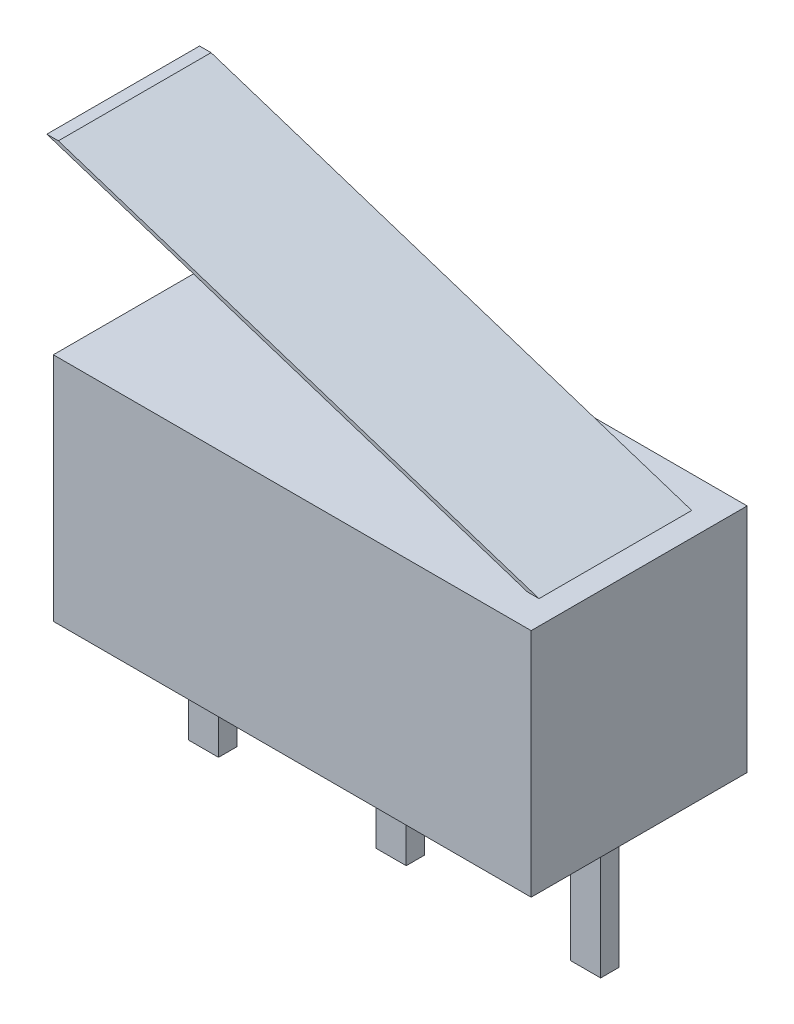
ISO-10303-21;
HEADER;
FILE_DESCRIPTION(('STEP AP214'),'2;1');
FILE_NAME('part.step','',(''),(''),'','','');
FILE_SCHEMA(('AUTOMOTIVE_DESIGN { 1 0 10303 214 1 1 1 1 }'));
ENDSEC;
DATA;
#1=APPLICATION_CONTEXT('core data for automotive mechanical design processes');
#2=APPLICATION_PROTOCOL_DEFINITION('international standard','automotive_design',2000,#1);
#3=PRODUCT_CONTEXT('',#1,'mechanical');
#4=PRODUCT('Part','Part','',(#3));
#5=PRODUCT_RELATED_PRODUCT_CATEGORY('part','',(#4));
#6=PRODUCT_DEFINITION_FORMATION('','',#4);
#7=PRODUCT_DEFINITION_CONTEXT('part definition',#1,'design');
#8=PRODUCT_DEFINITION('design','',#6,#7);
#9=PRODUCT_DEFINITION_SHAPE('','',#8);
#10=(LENGTH_UNIT() NAMED_UNIT(*) SI_UNIT(.MILLI.,.METRE.));
#11=(NAMED_UNIT(*) PLANE_ANGLE_UNIT() SI_UNIT($,.RADIAN.));
#12=(NAMED_UNIT(*) SI_UNIT($,.STERADIAN.) SOLID_ANGLE_UNIT());
#13=UNCERTAINTY_MEASURE_WITH_UNIT(LENGTH_MEASURE(1.E-05),#10,'distance_accuracy_value','');
#14=(GEOMETRIC_REPRESENTATION_CONTEXT(3) GLOBAL_UNCERTAINTY_ASSIGNED_CONTEXT((#13)) GLOBAL_UNIT_ASSIGNED_CONTEXT((#10,
#11,#12)) REPRESENTATION_CONTEXT('',''));
#15=CARTESIAN_POINT('',(0.,0.,0.));
#16=DIRECTION('',(0.,0.,1.));
#17=DIRECTION('',(1.,0.,0.));
#18=AXIS2_PLACEMENT_3D('',#15,#16,#17);
#19=CARTESIAN_POINT('',(0.,0.,0.));
#20=DIRECTION('',(0.,-1.,0.));
#21=DIRECTION('',(0.,0.,-1.));
#22=AXIS2_PLACEMENT_3D('',#19,#20,#21);
#23=PLANE('',#22);
#24=DIRECTION('',(0.,0.,-1.));
#25=VECTOR('',#24,1.);
#26=CARTESIAN_POINT('',(6.415,0.,2.9));
#27=LINE('',#26,#25);
#28=CARTESIAN_POINT('',(6.415,0.,2.9));
#29=VERTEX_POINT('',#28);
#30=CARTESIAN_POINT('',(6.415,0.,-2.9));
#31=VERTEX_POINT('',#30);
#32=EDGE_CURVE('E288',#29,#31,#27,.T.);
#33=ORIENTED_EDGE('',*,*,#32,.F.);
#34=DIRECTION('',(1.,0.,0.));
#35=VECTOR('',#34,1.);
#36=CARTESIAN_POINT('',(-6.415,0.,2.9));
#37=LINE('',#36,#35);
#38=CARTESIAN_POINT('',(-6.415,0.,2.9));
#39=VERTEX_POINT('',#38);
#40=EDGE_CURVE('E293',#39,#29,#37,.T.);
#41=ORIENTED_EDGE('',*,*,#40,.F.);
#42=DIRECTION('',(0.,0.,1.));
#43=VECTOR('',#42,1.);
#44=CARTESIAN_POINT('',(-6.415,0.,2.9));
#45=LINE('',#44,#43);
#46=CARTESIAN_POINT('',(-6.415,0.,-2.9));
#47=VERTEX_POINT('',#46);
#48=EDGE_CURVE('E304',#47,#39,#45,.T.);
#49=ORIENTED_EDGE('',*,*,#48,.F.);
#50=DIRECTION('',(-1.,0.,0.));
#51=VECTOR('',#50,1.);
#52=CARTESIAN_POINT('',(-6.415,0.,-2.9));
#53=LINE('',#52,#51);
#54=EDGE_CURVE('E302',#31,#47,#53,.T.);
#55=ORIENTED_EDGE('',*,*,#54,.F.);
#56=EDGE_LOOP('',(#33,#41,#49,#55));
#57=FACE_BOUND('',#56,.T.);
#58=DIRECTION('',(-1.,0.,0.));
#59=VECTOR('',#58,1.);
#60=CARTESIAN_POINT('',(-5.445,0.,0.245));
#61=LINE('',#60,#59);
#62=CARTESIAN_POINT('',(-4.635,0.,0.245));
#63=VERTEX_POINT('',#62);
#64=CARTESIAN_POINT('',(-5.445,0.,0.245));
#65=VERTEX_POINT('',#64);
#66=EDGE_CURVE('E241',#63,#65,#61,.T.);
#67=ORIENTED_EDGE('',*,*,#66,.F.);
#68=DIRECTION('',(0.,0.,1.));
#69=VECTOR('',#68,1.);
#70=CARTESIAN_POINT('',(-4.635,0.,-0.245));
#71=LINE('',#70,#69);
#72=CARTESIAN_POINT('',(-4.635,0.,-0.245));
#73=VERTEX_POINT('',#72);
#74=EDGE_CURVE('E227',#73,#63,#71,.T.);
#75=ORIENTED_EDGE('',*,*,#74,.F.);
#76=DIRECTION('',(1.,0.,0.));
#77=VECTOR('',#76,1.);
#78=CARTESIAN_POINT('',(-5.445,0.,-0.245));
#79=LINE('',#78,#77);
#80=CARTESIAN_POINT('',(-5.445,0.,-0.245));
#81=VERTEX_POINT('',#80);
#82=EDGE_CURVE('E232',#81,#73,#79,.T.);
#83=ORIENTED_EDGE('',*,*,#82,.F.);
#84=DIRECTION('',(0.,0.,-1.));
#85=VECTOR('',#84,1.);
#86=CARTESIAN_POINT('',(-5.445,0.,-0.245));
#87=LINE('',#86,#85);
#88=EDGE_CURVE('E243',#65,#81,#87,.T.);
#89=ORIENTED_EDGE('',*,*,#88,.F.);
#90=EDGE_LOOP('',(#67,#75,#83,#89));
#91=FACE_BOUND('',#90,.T.);
#92=DIRECTION('',(-1.,0.,0.));
#93=VECTOR('',#92,1.);
#94=CARTESIAN_POINT('',(-0.405,0.,0.245));
#95=LINE('',#94,#93);
#96=CARTESIAN_POINT('',(0.405,0.,0.245));
#97=VERTEX_POINT('',#96);
#98=CARTESIAN_POINT('',(-0.405,0.,0.245));
#99=VERTEX_POINT('',#98);
#100=EDGE_CURVE('E199',#97,#99,#95,.T.);
#101=ORIENTED_EDGE('',*,*,#100,.F.);
#102=DIRECTION('',(0.,0.,1.));
#103=VECTOR('',#102,1.);
#104=CARTESIAN_POINT('',(0.405,0.,-0.245));
#105=LINE('',#104,#103);
#106=CARTESIAN_POINT('',(0.405,0.,-0.245));
#107=VERTEX_POINT('',#106);
#108=EDGE_CURVE('E196',#107,#97,#105,.T.);
#109=ORIENTED_EDGE('',*,*,#108,.F.);
#110=DIRECTION('',(1.,0.,0.));
#111=VECTOR('',#110,1.);
#112=CARTESIAN_POINT('',(-0.405,0.,-0.245));
#113=LINE('',#112,#111);
#114=CARTESIAN_POINT('',(-0.405,0.,-0.245));
#115=VERTEX_POINT('',#114);
#116=EDGE_CURVE('E208',#115,#107,#113,.T.);
#117=ORIENTED_EDGE('',*,*,#116,.F.);
#118=DIRECTION('',(0.,0.,-1.));
#119=VECTOR('',#118,1.);
#120=CARTESIAN_POINT('',(-0.405,0.,-0.245));
#121=LINE('',#120,#119);
#122=EDGE_CURVE('E216',#99,#115,#121,.T.);
#123=ORIENTED_EDGE('',*,*,#122,.F.);
#124=EDGE_LOOP('',(#101,#109,#117,#123));
#125=FACE_BOUND('',#124,.T.);
#126=DIRECTION('',(-1.,0.,0.));
#127=VECTOR('',#126,1.);
#128=CARTESIAN_POINT('',(4.81593752789381,0.,0.245));
#129=LINE('',#128,#127);
#130=CARTESIAN_POINT('',(5.62593752789381,0.,0.245));
#131=VERTEX_POINT('',#130);
#132=CARTESIAN_POINT('',(4.81593752789381,0.,0.245));
#133=VERTEX_POINT('',#132);
#134=EDGE_CURVE('E580',#131,#133,#129,.T.);
#135=ORIENTED_EDGE('',*,*,#134,.F.);
#136=DIRECTION('',(0.,0.,1.));
#137=VECTOR('',#136,1.);
#138=CARTESIAN_POINT('',(5.62593752789381,0.,-0.245));
#139=LINE('',#138,#137);
#140=CARTESIAN_POINT('',(5.62593752789381,0.,-0.245));
#141=VERTEX_POINT('',#140);
#142=EDGE_CURVE('E194',#141,#131,#139,.T.);
#143=ORIENTED_EDGE('',*,*,#142,.F.);
#144=DIRECTION('',(1.,0.,0.));
#145=VECTOR('',#144,1.);
#146=CARTESIAN_POINT('',(4.81593752789381,0.,-0.245));
#147=LINE('',#146,#145);
#148=CARTESIAN_POINT('',(4.81593752789381,0.,-0.245));
#149=VERTEX_POINT('',#148);
#150=EDGE_CURVE('E190',#149,#141,#147,.T.);
#151=ORIENTED_EDGE('',*,*,#150,.F.);
#152=DIRECTION('',(0.,0.,-1.));
#153=VECTOR('',#152,1.);
#154=CARTESIAN_POINT('',(4.81593752789381,0.,-0.245));
#155=LINE('',#154,#153);
#156=EDGE_CURVE('E577',#133,#149,#155,.T.);
#157=ORIENTED_EDGE('',*,*,#156,.F.);
#158=EDGE_LOOP('',(#135,#143,#151,#157));
#159=FACE_BOUND('',#158,.T.);
#160=ADVANCED_FACE('F33',(#57,#91,#125,#159),#23,.T.);
#161=CARTESIAN_POINT('',(0.,6.2,0.));
#162=DIRECTION('',(0.,-1.,0.));
#163=DIRECTION('',(0.,0.,-1.));
#164=AXIS2_PLACEMENT_3D('',#161,#162,#163);
#165=PLANE('',#164);
#166=DIRECTION('',(0.,0.,-1.));
#167=VECTOR('',#166,1.);
#168=CARTESIAN_POINT('',(6.415,6.2,2.9));
#169=LINE('',#168,#167);
#170=CARTESIAN_POINT('',(6.415,6.2,2.9));
#171=VERTEX_POINT('',#170);
#172=CARTESIAN_POINT('',(6.415,6.2,-2.9));
#173=VERTEX_POINT('',#172);
#174=EDGE_CURVE('E289',#171,#173,#169,.T.);
#175=ORIENTED_EDGE('',*,*,#174,.T.);
#176=DIRECTION('',(-1.,0.,0.));
#177=VECTOR('',#176,1.);
#178=CARTESIAN_POINT('',(-6.415,6.2,-2.9));
#179=LINE('',#178,#177);
#180=CARTESIAN_POINT('',(-6.415,6.2,-2.9));
#181=VERTEX_POINT('',#180);
#182=EDGE_CURVE('E292',#173,#181,#179,.T.);
#183=ORIENTED_EDGE('',*,*,#182,.T.);
#184=DIRECTION('',(0.,0.,1.));
#185=VECTOR('',#184,1.);
#186=CARTESIAN_POINT('',(-6.415,6.2,2.9));
#187=LINE('',#186,#185);
#188=CARTESIAN_POINT('',(-6.415,6.2,2.9));
#189=VERTEX_POINT('',#188);
#190=EDGE_CURVE('E295',#181,#189,#187,.T.);
#191=ORIENTED_EDGE('',*,*,#190,.T.);
#192=DIRECTION('',(1.,0.,0.));
#193=VECTOR('',#192,1.);
#194=CARTESIAN_POINT('',(-6.415,6.2,2.9));
#195=LINE('',#194,#193);
#196=EDGE_CURVE('E297',#189,#171,#195,.T.);
#197=ORIENTED_EDGE('',*,*,#196,.T.);
#198=EDGE_LOOP('',(#175,#183,#191,#197));
#199=FACE_BOUND('',#198,.T.);
#200=DIRECTION('',(0.,0.,-1.));
#201=VECTOR('',#200,1.);
#202=CARTESIAN_POINT('',(5.77620929894976,6.2,-2.05));
#203=LINE('',#202,#201);
#204=CARTESIAN_POINT('',(5.77620929894976,6.2,2.05));
#205=VERTEX_POINT('',#204);
#206=CARTESIAN_POINT('',(5.77620929894976,6.2,-2.05));
#207=VERTEX_POINT('',#206);
#208=EDGE_CURVE('E272',#205,#207,#203,.T.);
#209=ORIENTED_EDGE('',*,*,#208,.F.);
#210=DIRECTION('',(1.,0.,0.));
#211=VECTOR('',#210,1.);
#212=CARTESIAN_POINT('',(5.46620929894976,6.2,2.05));
#213=LINE('',#212,#211);
#214=CARTESIAN_POINT('',(5.46620929894976,6.2,2.05));
#215=VERTEX_POINT('',#214);
#216=EDGE_CURVE('E259',#215,#205,#213,.T.);
#217=ORIENTED_EDGE('',*,*,#216,.F.);
#218=DIRECTION('',(0.,0.,1.));
#219=VECTOR('',#218,1.);
#220=CARTESIAN_POINT('',(5.46620929894976,6.2,-2.05));
#221=LINE('',#220,#219);
#222=CARTESIAN_POINT('',(5.46620929894976,6.2,-2.05));
#223=VERTEX_POINT('',#222);
#224=EDGE_CURVE('E256',#223,#215,#221,.T.);
#225=ORIENTED_EDGE('',*,*,#224,.F.);
#226=DIRECTION('',(-1.,0.,0.));
#227=VECTOR('',#226,1.);
#228=CARTESIAN_POINT('',(5.46620929894976,6.2,-2.05));
#229=LINE('',#228,#227);
#230=EDGE_CURVE('E269',#207,#223,#229,.T.);
#231=ORIENTED_EDGE('',*,*,#230,.F.);
#232=EDGE_LOOP('',(#209,#217,#225,#231));
#233=FACE_BOUND('',#232,.T.);
#234=ADVANCED_FACE('F331',(#199,#233),#165,.F.);
#235=CARTESIAN_POINT('',(6.415,6.2,2.9));
#236=DIRECTION('',(-1.,0.,0.));
#237=DIRECTION('',(0.,0.,1.));
#238=AXIS2_PLACEMENT_3D('',#235,#236,#237);
#239=PLANE('',#238);
#240=ORIENTED_EDGE('',*,*,#32,.T.);
#241=DIRECTION('',(0.,-1.,0.));
#242=VECTOR('',#241,1.);
#243=CARTESIAN_POINT('',(6.415,6.2,-2.9));
#244=LINE('',#243,#242);
#245=EDGE_CURVE('E11',#173,#31,#244,.T.);
#246=ORIENTED_EDGE('',*,*,#245,.F.);
#247=ORIENTED_EDGE('',*,*,#174,.F.);
#248=DIRECTION('',(0.,-1.,0.));
#249=VECTOR('',#248,1.);
#250=CARTESIAN_POINT('',(6.415,6.2,2.9));
#251=LINE('',#250,#249);
#252=EDGE_CURVE('E299',#171,#29,#251,.T.);
#253=ORIENTED_EDGE('',*,*,#252,.T.);
#254=EDGE_LOOP('',(#240,#246,#247,#253));
#255=FACE_BOUND('',#254,.T.);
#256=ADVANCED_FACE('F35',(#255),#239,.F.);
#257=CARTESIAN_POINT('',(-6.415,6.2,-2.9));
#258=DIRECTION('',(0.,0.,1.));
#259=DIRECTION('',(1.,0.,0.));
#260=AXIS2_PLACEMENT_3D('',#257,#258,#259);
#261=PLANE('',#260);
#262=ORIENTED_EDGE('',*,*,#54,.T.);
#263=DIRECTION('',(0.,-1.,0.));
#264=VECTOR('',#263,1.);
#265=CARTESIAN_POINT('',(-6.415,6.2,-2.9));
#266=LINE('',#265,#264);
#267=EDGE_CURVE('E41',#181,#47,#266,.T.);
#268=ORIENTED_EDGE('',*,*,#267,.F.);
#269=ORIENTED_EDGE('',*,*,#182,.F.);
#270=ORIENTED_EDGE('',*,*,#245,.T.);
#271=EDGE_LOOP('',(#262,#268,#269,#270));
#272=FACE_BOUND('',#271,.T.);
#273=ADVANCED_FACE('F333',(#272),#261,.F.);
#274=CARTESIAN_POINT('',(-6.415,6.2,2.9));
#275=DIRECTION('',(1.,0.,0.));
#276=DIRECTION('',(0.,0.,-1.));
#277=AXIS2_PLACEMENT_3D('',#274,#275,#276);
#278=PLANE('',#277);
#279=ORIENTED_EDGE('',*,*,#48,.T.);
#280=DIRECTION('',(0.,-1.,0.));
#281=VECTOR('',#280,1.);
#282=CARTESIAN_POINT('',(-6.415,6.2,2.9));
#283=LINE('',#282,#281);
#284=EDGE_CURVE('E309',#189,#39,#283,.T.);
#285=ORIENTED_EDGE('',*,*,#284,.F.);
#286=ORIENTED_EDGE('',*,*,#190,.F.);
#287=ORIENTED_EDGE('',*,*,#267,.T.);
#288=EDGE_LOOP('',(#279,#285,#286,#287));
#289=FACE_BOUND('',#288,.T.);
#290=ADVANCED_FACE('F316',(#289),#278,.F.);
#291=CARTESIAN_POINT('',(-6.415,6.2,2.9));
#292=DIRECTION('',(0.,0.,-1.));
#293=DIRECTION('',(-1.,0.,0.));
#294=AXIS2_PLACEMENT_3D('',#291,#292,#293);
#295=PLANE('',#294);
#296=ORIENTED_EDGE('',*,*,#40,.T.);
#297=ORIENTED_EDGE('',*,*,#252,.F.);
#298=ORIENTED_EDGE('',*,*,#196,.F.);
#299=ORIENTED_EDGE('',*,*,#284,.T.);
#300=EDGE_LOOP('',(#296,#297,#298,#299));
#301=FACE_BOUND('',#300,.T.);
#302=ADVANCED_FACE('F325',(#301),#295,.F.);
#303=CARTESIAN_POINT('',(-12.9060894719648,10.3925832778419,0.));
#304=DIRECTION('',(0.,1.,0.));
#305=DIRECTION('',(0.,0.,1.));
#306=AXIS2_PLACEMENT_3D('',#303,#304,#305);
#307=PLANE('',#306);
#308=DIRECTION('',(0.,0.,-1.));
#309=VECTOR('',#308,1.);
#310=CARTESIAN_POINT('',(-7.12988017301502,10.3925832778419,-2.05));
#311=LINE('',#310,#309);
#312=CARTESIAN_POINT('',(-7.12988017301503,10.3925832778419,2.05));
#313=VERTEX_POINT('',#312);
#314=CARTESIAN_POINT('',(-7.12988017301503,10.3925832778419,-2.05));
#315=VERTEX_POINT('',#314);
#316=EDGE_CURVE('E277',#313,#315,#311,.T.);
#317=ORIENTED_EDGE('',*,*,#316,.T.);
#318=DIRECTION('',(-1.,0.,0.));
#319=VECTOR('',#318,1.);
#320=CARTESIAN_POINT('',(-7.43988017301503,10.3925832778419,-2.05));
#321=LINE('',#320,#319);
#322=CARTESIAN_POINT('',(-7.43988017301503,10.3925832778419,-2.05));
#323=VERTEX_POINT('',#322);
#324=EDGE_CURVE('E284',#315,#323,#321,.T.);
#325=ORIENTED_EDGE('',*,*,#324,.T.);
#326=DIRECTION('',(0.,0.,1.));
#327=VECTOR('',#326,1.);
#328=CARTESIAN_POINT('',(-7.43988017301503,10.3925832778419,-2.05));
#329=LINE('',#328,#327);
#330=CARTESIAN_POINT('',(-7.43988017301503,10.3925832778419,2.05));
#331=VERTEX_POINT('',#330);
#332=EDGE_CURVE('E260',#323,#331,#329,.T.);
#333=ORIENTED_EDGE('',*,*,#332,.T.);
#334=DIRECTION('',(1.,0.,0.));
#335=VECTOR('',#334,1.);
#336=CARTESIAN_POINT('',(-7.43988017301502,10.3925832778419,2.05));
#337=LINE('',#336,#335);
#338=EDGE_CURVE('E266',#331,#313,#337,.T.);
#339=ORIENTED_EDGE('',*,*,#338,.T.);
#340=EDGE_LOOP('',(#317,#325,#333,#339));
#341=FACE_BOUND('',#340,.T.);
#342=ADVANCED_FACE('F349',(#341),#307,.T.);
#343=CARTESIAN_POINT('',(5.46620929894976,6.2,-2.05));
#344=DIRECTION('',(-0.308959710968455,-0.951075126894973,0.));
#345=DIRECTION('',(0.951075126894973,-0.308959710968455,0.));
#346=AXIS2_PLACEMENT_3D('',#343,#344,#345);
#347=PLANE('',#346);
#348=DIRECTION('',(-0.951075126894973,0.308959710968455,0.));
#349=VECTOR('',#348,1.);
#350=CARTESIAN_POINT('',(5.46620929894976,6.2,2.05));
#351=LINE('',#350,#349);
#352=EDGE_CURVE('E262',#215,#331,#351,.T.);
#353=ORIENTED_EDGE('',*,*,#352,.T.);
#354=ORIENTED_EDGE('',*,*,#332,.F.);
#355=DIRECTION('',(-0.951075126894973,0.308959710968455,0.));
#356=VECTOR('',#355,1.);
#357=CARTESIAN_POINT('',(5.46620929894976,6.2,-2.05));
#358=LINE('',#357,#356);
#359=EDGE_CURVE('E263',#223,#323,#358,.T.);
#360=ORIENTED_EDGE('',*,*,#359,.F.);
#361=ORIENTED_EDGE('',*,*,#224,.T.);
#362=EDGE_LOOP('',(#353,#354,#360,#361));
#363=FACE_BOUND('',#362,.T.);
#364=ADVANCED_FACE('F354',(#363),#347,.T.);
#365=CARTESIAN_POINT('',(5.46620929894976,6.2,2.05));
#366=DIRECTION('',(0.,0.,1.));
#367=DIRECTION('',(1.,0.,0.));
#368=AXIS2_PLACEMENT_3D('',#365,#366,#367);
#369=PLANE('',#368);
#370=DIRECTION('',(-0.951075126894973,0.308959710968455,0.));
#371=VECTOR('',#370,1.);
#372=CARTESIAN_POINT('',(5.77620929894976,6.2,2.05));
#373=LINE('',#372,#371);
#374=EDGE_CURVE('E274',#205,#313,#373,.T.);
#375=ORIENTED_EDGE('',*,*,#374,.T.);
#376=ORIENTED_EDGE('',*,*,#338,.F.);
#377=ORIENTED_EDGE('',*,*,#352,.F.);
#378=ORIENTED_EDGE('',*,*,#216,.T.);
#379=EDGE_LOOP('',(#375,#376,#377,#378));
#380=FACE_BOUND('',#379,.T.);
#381=ADVANCED_FACE('F368',(#380),#369,.T.);
#382=CARTESIAN_POINT('',(5.77620929894976,6.2,-2.05));
#383=DIRECTION('',(0.308959710968455,0.951075126894973,0.));
#384=DIRECTION('',(-0.951075126894973,0.308959710968455,0.));
#385=AXIS2_PLACEMENT_3D('',#382,#383,#384);
#386=PLANE('',#385);
#387=DIRECTION('',(-0.951075126894973,0.308959710968455,0.));
#388=VECTOR('',#387,1.);
#389=CARTESIAN_POINT('',(5.77620929894976,6.2,-2.05));
#390=LINE('',#389,#388);
#391=EDGE_CURVE('E281',#207,#315,#390,.T.);
#392=ORIENTED_EDGE('',*,*,#391,.T.);
#393=ORIENTED_EDGE('',*,*,#316,.F.);
#394=ORIENTED_EDGE('',*,*,#374,.F.);
#395=ORIENTED_EDGE('',*,*,#208,.T.);
#396=EDGE_LOOP('',(#392,#393,#394,#395));
#397=FACE_BOUND('',#396,.T.);
#398=ADVANCED_FACE('F358',(#397),#386,.T.);
#399=CARTESIAN_POINT('',(5.46620929894976,6.2,-2.05));
#400=DIRECTION('',(0.,0.,-1.));
#401=DIRECTION('',(-1.,0.,0.));
#402=AXIS2_PLACEMENT_3D('',#399,#400,#401);
#403=PLANE('',#402);
#404=ORIENTED_EDGE('',*,*,#324,.F.);
#405=ORIENTED_EDGE('',*,*,#391,.F.);
#406=ORIENTED_EDGE('',*,*,#230,.T.);
#407=ORIENTED_EDGE('',*,*,#359,.T.);
#408=EDGE_LOOP('',(#404,#405,#406,#407));
#409=FACE_BOUND('',#408,.T.);
#410=ADVANCED_FACE('F350',(#409),#403,.T.);
#411=CARTESIAN_POINT('',(-4.635,-3.6,-0.245));
#412=DIRECTION('',(-1.,0.,0.));
#413=DIRECTION('',(0.,0.,1.));
#414=AXIS2_PLACEMENT_3D('',#411,#412,#413);
#415=PLANE('',#414);
#416=ORIENTED_EDGE('',*,*,#74,.T.);
#417=DIRECTION('',(0.,1.,0.));
#418=VECTOR('',#417,1.);
#419=CARTESIAN_POINT('',(-4.635,-3.6,0.245));
#420=LINE('',#419,#418);
#421=CARTESIAN_POINT('',(-4.635,-3.6,0.245));
#422=VERTEX_POINT('',#421);
#423=EDGE_CURVE('E254',#422,#63,#420,.T.);
#424=ORIENTED_EDGE('',*,*,#423,.F.);
#425=DIRECTION('',(0.,0.,1.));
#426=VECTOR('',#425,1.);
#427=CARTESIAN_POINT('',(-4.635,-3.6,-0.245));
#428=LINE('',#427,#426);
#429=CARTESIAN_POINT('',(-4.635,-3.6,-0.245));
#430=VERTEX_POINT('',#429);
#431=EDGE_CURVE('E228',#430,#422,#428,.T.);
#432=ORIENTED_EDGE('',*,*,#431,.F.);
#433=DIRECTION('',(0.,1.,0.));
#434=VECTOR('',#433,1.);
#435=CARTESIAN_POINT('',(-4.635,-3.6,-0.245));
#436=LINE('',#435,#434);
#437=EDGE_CURVE('E238',#430,#73,#436,.T.);
#438=ORIENTED_EDGE('',*,*,#437,.T.);
#439=EDGE_LOOP('',(#416,#424,#432,#438));
#440=FACE_BOUND('',#439,.T.);
#441=ADVANCED_FACE('F356',(#440),#415,.F.);
#442=CARTESIAN_POINT('',(-5.445,-3.6,0.245));
#443=DIRECTION('',(0.,0.,-1.));
#444=DIRECTION('',(-1.,0.,0.));
#445=AXIS2_PLACEMENT_3D('',#442,#443,#444);
#446=PLANE('',#445);
#447=ORIENTED_EDGE('',*,*,#66,.T.);
#448=DIRECTION('',(0.,1.,0.));
#449=VECTOR('',#448,1.);
#450=CARTESIAN_POINT('',(-5.445,-3.6,0.245));
#451=LINE('',#450,#449);
#452=CARTESIAN_POINT('',(-5.445,-3.6,0.245));
#453=VERTEX_POINT('',#452);
#454=EDGE_CURVE('E251',#453,#65,#451,.T.);
#455=ORIENTED_EDGE('',*,*,#454,.F.);
#456=DIRECTION('',(-1.,0.,0.));
#457=VECTOR('',#456,1.);
#458=CARTESIAN_POINT('',(-5.445,-3.6,0.245));
#459=LINE('',#458,#457);
#460=EDGE_CURVE('E231',#422,#453,#459,.T.);
#461=ORIENTED_EDGE('',*,*,#460,.F.);
#462=ORIENTED_EDGE('',*,*,#423,.T.);
#463=EDGE_LOOP('',(#447,#455,#461,#462));
#464=FACE_BOUND('',#463,.T.);
#465=ADVANCED_FACE('F365',(#464),#446,.F.);
#466=CARTESIAN_POINT('',(-5.445,-3.6,-0.245));
#467=DIRECTION('',(1.,0.,0.));
#468=DIRECTION('',(0.,0.,-1.));
#469=AXIS2_PLACEMENT_3D('',#466,#467,#468);
#470=PLANE('',#469);
#471=ORIENTED_EDGE('',*,*,#88,.T.);
#472=DIRECTION('',(0.,1.,0.));
#473=VECTOR('',#472,1.);
#474=CARTESIAN_POINT('',(-5.445,-3.6,-0.245));
#475=LINE('',#474,#473);
#476=CARTESIAN_POINT('',(-5.445,-3.6,-0.245));
#477=VERTEX_POINT('',#476);
#478=EDGE_CURVE('E249',#477,#81,#475,.T.);
#479=ORIENTED_EDGE('',*,*,#478,.F.);
#480=DIRECTION('',(0.,0.,-1.));
#481=VECTOR('',#480,1.);
#482=CARTESIAN_POINT('',(-5.445,-3.6,-0.245));
#483=LINE('',#482,#481);
#484=EDGE_CURVE('E234',#453,#477,#483,.T.);
#485=ORIENTED_EDGE('',*,*,#484,.F.);
#486=ORIENTED_EDGE('',*,*,#454,.T.);
#487=EDGE_LOOP('',(#471,#479,#485,#486));
#488=FACE_BOUND('',#487,.T.);
#489=ADVANCED_FACE('F381',(#488),#470,.F.);
#490=CARTESIAN_POINT('',(-5.445,-3.6,-0.245));
#491=DIRECTION('',(0.,0.,1.));
#492=DIRECTION('',(1.,0.,0.));
#493=AXIS2_PLACEMENT_3D('',#490,#491,#492);
#494=PLANE('',#493);
#495=ORIENTED_EDGE('',*,*,#82,.T.);
#496=ORIENTED_EDGE('',*,*,#437,.F.);
#497=DIRECTION('',(1.,0.,0.));
#498=VECTOR('',#497,1.);
#499=CARTESIAN_POINT('',(-5.445,-3.6,-0.245));
#500=LINE('',#499,#498);
#501=EDGE_CURVE('E236',#477,#430,#500,.T.);
#502=ORIENTED_EDGE('',*,*,#501,.F.);
#503=ORIENTED_EDGE('',*,*,#478,.T.);
#504=EDGE_LOOP('',(#495,#496,#502,#503));
#505=FACE_BOUND('',#504,.T.);
#506=ADVANCED_FACE('F385',(#505),#494,.F.);
#507=CARTESIAN_POINT('',(0.,-3.6,0.));
#508=DIRECTION('',(0.,1.,0.));
#509=DIRECTION('',(0.,0.,1.));
#510=AXIS2_PLACEMENT_3D('',#507,#508,#509);
#511=PLANE('',#510);
#512=ORIENTED_EDGE('',*,*,#431,.T.);
#513=ORIENTED_EDGE('',*,*,#460,.T.);
#514=ORIENTED_EDGE('',*,*,#484,.T.);
#515=ORIENTED_EDGE('',*,*,#501,.T.);
#516=EDGE_LOOP('',(#512,#513,#514,#515));
#517=FACE_BOUND('',#516,.T.);
#518=ADVANCED_FACE('F389',(#517),#511,.F.);
#519=CARTESIAN_POINT('',(0.405,-3.6,-0.245));
#520=DIRECTION('',(-1.,0.,0.));
#521=DIRECTION('',(0.,0.,1.));
#522=AXIS2_PLACEMENT_3D('',#519,#520,#521);
#523=PLANE('',#522);
#524=ORIENTED_EDGE('',*,*,#108,.T.);
#525=DIRECTION('',(0.,1.,0.));
#526=VECTOR('',#525,1.);
#527=CARTESIAN_POINT('',(0.405,-3.6,0.245));
#528=LINE('',#527,#526);
#529=CARTESIAN_POINT('',(0.405,-3.6,0.245));
#530=VERTEX_POINT('',#529);
#531=EDGE_CURVE('E225',#530,#97,#528,.T.);
#532=ORIENTED_EDGE('',*,*,#531,.F.);
#533=DIRECTION('',(0.,0.,1.));
#534=VECTOR('',#533,1.);
#535=CARTESIAN_POINT('',(0.405,-3.6,-0.245));
#536=LINE('',#535,#534);
#537=CARTESIAN_POINT('',(0.405,-3.6,-0.245));
#538=VERTEX_POINT('',#537);
#539=EDGE_CURVE('E204',#538,#530,#536,.T.);
#540=ORIENTED_EDGE('',*,*,#539,.F.);
#541=DIRECTION('',(0.,1.,0.));
#542=VECTOR('',#541,1.);
#543=CARTESIAN_POINT('',(0.405,-3.6,-0.245));
#544=LINE('',#543,#542);
#545=EDGE_CURVE('E213',#538,#107,#544,.T.);
#546=ORIENTED_EDGE('',*,*,#545,.T.);
#547=EDGE_LOOP('',(#524,#532,#540,#546));
#548=FACE_BOUND('',#547,.T.);
#549=ADVANCED_FACE('F393',(#548),#523,.F.);
#550=CARTESIAN_POINT('',(-0.405,-3.6,0.245));
#551=DIRECTION('',(0.,0.,-1.));
#552=DIRECTION('',(-1.,0.,0.));
#553=AXIS2_PLACEMENT_3D('',#550,#551,#552);
#554=PLANE('',#553);
#555=ORIENTED_EDGE('',*,*,#100,.T.);
#556=DIRECTION('',(0.,1.,0.));
#557=VECTOR('',#556,1.);
#558=CARTESIAN_POINT('',(-0.405,-3.6,0.245));
#559=LINE('',#558,#557);
#560=CARTESIAN_POINT('',(-0.405,-3.6,0.245));
#561=VERTEX_POINT('',#560);
#562=EDGE_CURVE('E222',#561,#99,#559,.T.);
#563=ORIENTED_EDGE('',*,*,#562,.F.);
#564=DIRECTION('',(-1.,0.,0.));
#565=VECTOR('',#564,1.);
#566=CARTESIAN_POINT('',(-0.405,-3.6,0.245));
#567=LINE('',#566,#565);
#568=EDGE_CURVE('E207',#530,#561,#567,.T.);
#569=ORIENTED_EDGE('',*,*,#568,.F.);
#570=ORIENTED_EDGE('',*,*,#531,.T.);
#571=EDGE_LOOP('',(#555,#563,#569,#570));
#572=FACE_BOUND('',#571,.T.);
#573=ADVANCED_FACE('F397',(#572),#554,.F.);
#574=CARTESIAN_POINT('',(-0.405,-3.6,-0.245));
#575=DIRECTION('',(1.,0.,0.));
#576=DIRECTION('',(0.,0.,-1.));
#577=AXIS2_PLACEMENT_3D('',#574,#575,#576);
#578=PLANE('',#577);
#579=ORIENTED_EDGE('',*,*,#122,.T.);
#580=DIRECTION('',(0.,1.,0.));
#581=VECTOR('',#580,1.);
#582=CARTESIAN_POINT('',(-0.405,-3.6,-0.245));
#583=LINE('',#582,#581);
#584=CARTESIAN_POINT('',(-0.405,-3.6,-0.245));
#585=VERTEX_POINT('',#584);
#586=EDGE_CURVE('E56',#585,#115,#583,.T.);
#587=ORIENTED_EDGE('',*,*,#586,.F.);
#588=DIRECTION('',(0.,0.,-1.));
#589=VECTOR('',#588,1.);
#590=CARTESIAN_POINT('',(-0.405,-3.6,-0.245));
#591=LINE('',#590,#589);
#592=EDGE_CURVE('E210',#561,#585,#591,.T.);
#593=ORIENTED_EDGE('',*,*,#592,.F.);
#594=ORIENTED_EDGE('',*,*,#562,.T.);
#595=EDGE_LOOP('',(#579,#587,#593,#594));
#596=FACE_BOUND('',#595,.T.);
#597=ADVANCED_FACE('F401',(#596),#578,.F.);
#598=CARTESIAN_POINT('',(-0.405,-3.6,-0.245));
#599=DIRECTION('',(0.,0.,1.));
#600=DIRECTION('',(1.,0.,0.));
#601=AXIS2_PLACEMENT_3D('',#598,#599,#600);
#602=PLANE('',#601);
#603=ORIENTED_EDGE('',*,*,#116,.T.);
#604=ORIENTED_EDGE('',*,*,#545,.F.);
#605=DIRECTION('',(1.,0.,0.));
#606=VECTOR('',#605,1.);
#607=CARTESIAN_POINT('',(-0.405,-3.6,-0.245));
#608=LINE('',#607,#606);
#609=EDGE_CURVE('E212',#585,#538,#608,.T.);
#610=ORIENTED_EDGE('',*,*,#609,.F.);
#611=ORIENTED_EDGE('',*,*,#586,.T.);
#612=EDGE_LOOP('',(#603,#604,#610,#611));
#613=FACE_BOUND('',#612,.T.);
#614=ADVANCED_FACE('F405',(#613),#602,.F.);
#615=CARTESIAN_POINT('',(0.,-3.6,0.));
#616=DIRECTION('',(0.,1.,0.));
#617=DIRECTION('',(0.,0.,1.));
#618=AXIS2_PLACEMENT_3D('',#615,#616,#617);
#619=PLANE('',#618);
#620=ORIENTED_EDGE('',*,*,#539,.T.);
#621=ORIENTED_EDGE('',*,*,#568,.T.);
#622=ORIENTED_EDGE('',*,*,#592,.T.);
#623=ORIENTED_EDGE('',*,*,#609,.T.);
#624=EDGE_LOOP('',(#620,#621,#622,#623));
#625=FACE_BOUND('',#624,.T.);
#626=ADVANCED_FACE('F409',(#625),#619,.F.);
#627=CARTESIAN_POINT('',(5.62593752789381,-3.6,-0.245));
#628=DIRECTION('',(-1.,0.,0.));
#629=DIRECTION('',(0.,0.,1.));
#630=AXIS2_PLACEMENT_3D('',#627,#628,#629);
#631=PLANE('',#630);
#632=ORIENTED_EDGE('',*,*,#142,.T.);
#633=DIRECTION('',(0.,1.,0.));
#634=VECTOR('',#633,1.);
#635=CARTESIAN_POINT('',(5.62593752789381,-3.6,0.245));
#636=LINE('',#635,#634);
#637=CARTESIAN_POINT('',(5.62593752789381,-3.6,0.245));
#638=VERTEX_POINT('',#637);
#639=EDGE_CURVE('E175',#638,#131,#636,.T.);
#640=ORIENTED_EDGE('',*,*,#639,.F.);
#641=DIRECTION('',(0.,0.,1.));
#642=VECTOR('',#641,1.);
#643=CARTESIAN_POINT('',(5.62593752789381,-3.6,-0.245));
#644=LINE('',#643,#642);
#645=CARTESIAN_POINT('',(5.62593752789381,-3.6,-0.245));
#646=VERTEX_POINT('',#645);
#647=EDGE_CURVE('E182',#646,#638,#644,.T.);
#648=ORIENTED_EDGE('',*,*,#647,.F.);
#649=DIRECTION('',(0.,1.,0.));
#650=VECTOR('',#649,1.);
#651=CARTESIAN_POINT('',(5.62593752789381,-3.6,-0.245));
#652=LINE('',#651,#650);
#653=EDGE_CURVE('E574',#646,#141,#652,.T.);
#654=ORIENTED_EDGE('',*,*,#653,.T.);
#655=EDGE_LOOP('',(#632,#640,#648,#654));
#656=FACE_BOUND('',#655,.T.);
#657=ADVANCED_FACE('F192',(#656),#631,.F.);
#658=CARTESIAN_POINT('',(4.81593752789381,-3.6,0.245));
#659=DIRECTION('',(0.,0.,-1.));
#660=DIRECTION('',(-1.,0.,0.));
#661=AXIS2_PLACEMENT_3D('',#658,#659,#660);
#662=PLANE('',#661);
#663=ORIENTED_EDGE('',*,*,#134,.T.);
#664=DIRECTION('',(0.,1.,0.));
#665=VECTOR('',#664,1.);
#666=CARTESIAN_POINT('',(4.81593752789381,-3.6,0.245));
#667=LINE('',#666,#665);
#668=CARTESIAN_POINT('',(4.81593752789381,-3.6,0.245));
#669=VERTEX_POINT('',#668);
#670=EDGE_CURVE('E178',#669,#133,#667,.T.);
#671=ORIENTED_EDGE('',*,*,#670,.F.);
#672=DIRECTION('',(-1.,0.,0.));
#673=VECTOR('',#672,1.);
#674=CARTESIAN_POINT('',(4.81593752789381,-3.6,0.245));
#675=LINE('',#674,#673);
#676=EDGE_CURVE('E171',#638,#669,#675,.T.);
#677=ORIENTED_EDGE('',*,*,#676,.F.);
#678=ORIENTED_EDGE('',*,*,#639,.T.);
#679=EDGE_LOOP('',(#663,#671,#677,#678));
#680=FACE_BOUND('',#679,.T.);
#681=ADVANCED_FACE('F173',(#680),#662,.F.);
#682=CARTESIAN_POINT('',(4.81593752789381,-3.6,-0.245));
#683=DIRECTION('',(1.,0.,0.));
#684=DIRECTION('',(0.,0.,-1.));
#685=AXIS2_PLACEMENT_3D('',#682,#683,#684);
#686=PLANE('',#685);
#687=ORIENTED_EDGE('',*,*,#156,.T.);
#688=DIRECTION('',(0.,1.,0.));
#689=VECTOR('',#688,1.);
#690=CARTESIAN_POINT('',(4.81593752789381,-3.6,-0.245));
#691=LINE('',#690,#689);
#692=CARTESIAN_POINT('',(4.81593752789381,-3.6,-0.245));
#693=VERTEX_POINT('',#692);
#694=EDGE_CURVE('E48',#693,#149,#691,.T.);
#695=ORIENTED_EDGE('',*,*,#694,.F.);
#696=DIRECTION('',(0.,0.,-1.));
#697=VECTOR('',#696,1.);
#698=CARTESIAN_POINT('',(4.81593752789381,-3.6,-0.245));
#699=LINE('',#698,#697);
#700=EDGE_CURVE('E181',#669,#693,#699,.T.);
#701=ORIENTED_EDGE('',*,*,#700,.F.);
#702=ORIENTED_EDGE('',*,*,#670,.T.);
#703=EDGE_LOOP('',(#687,#695,#701,#702));
#704=FACE_BOUND('',#703,.T.);
#705=ADVANCED_FACE('F417',(#704),#686,.F.);
#706=CARTESIAN_POINT('',(4.81593752789381,-3.6,-0.245));
#707=DIRECTION('',(0.,0.,1.));
#708=DIRECTION('',(1.,0.,0.));
#709=AXIS2_PLACEMENT_3D('',#706,#707,#708);
#710=PLANE('',#709);
#711=ORIENTED_EDGE('',*,*,#150,.T.);
#712=ORIENTED_EDGE('',*,*,#653,.F.);
#713=DIRECTION('',(1.,0.,0.));
#714=VECTOR('',#713,1.);
#715=CARTESIAN_POINT('',(4.81593752789381,-3.6,-0.245));
#716=LINE('',#715,#714);
#717=EDGE_CURVE('E186',#693,#646,#716,.T.);
#718=ORIENTED_EDGE('',*,*,#717,.F.);
#719=ORIENTED_EDGE('',*,*,#694,.T.);
#720=EDGE_LOOP('',(#711,#712,#718,#719));
#721=FACE_BOUND('',#720,.T.);
#722=ADVANCED_FACE('F420',(#721),#710,.F.);
#723=CARTESIAN_POINT('',(0.,-3.6,0.));
#724=DIRECTION('',(0.,1.,0.));
#725=DIRECTION('',(0.,0.,1.));
#726=AXIS2_PLACEMENT_3D('',#723,#724,#725);
#727=PLANE('',#726);
#728=ORIENTED_EDGE('',*,*,#647,.T.);
#729=ORIENTED_EDGE('',*,*,#676,.T.);
#730=ORIENTED_EDGE('',*,*,#700,.T.);
#731=ORIENTED_EDGE('',*,*,#717,.T.);
#732=EDGE_LOOP('',(#728,#729,#730,#731));
#733=FACE_BOUND('',#732,.T.);
#734=ADVANCED_FACE('F185',(#733),#727,.F.);
#735=CLOSED_SHELL('',(#160,#234,#256,#273,#290,#302,#342,#364,#381,#398,#410,#441,#465,#489,
#506,#518,#549,#573,#597,#614,#626,#657,#681,#705,#722,#734));
#736=MANIFOLD_SOLID_BREP('B2',#735);
#737=ADVANCED_BREP_SHAPE_REPRESENTATION('',(#18,#736),#14);
#738=SHAPE_DEFINITION_REPRESENTATION(#9,#737);
ENDSEC;
END-ISO-10303-21;
